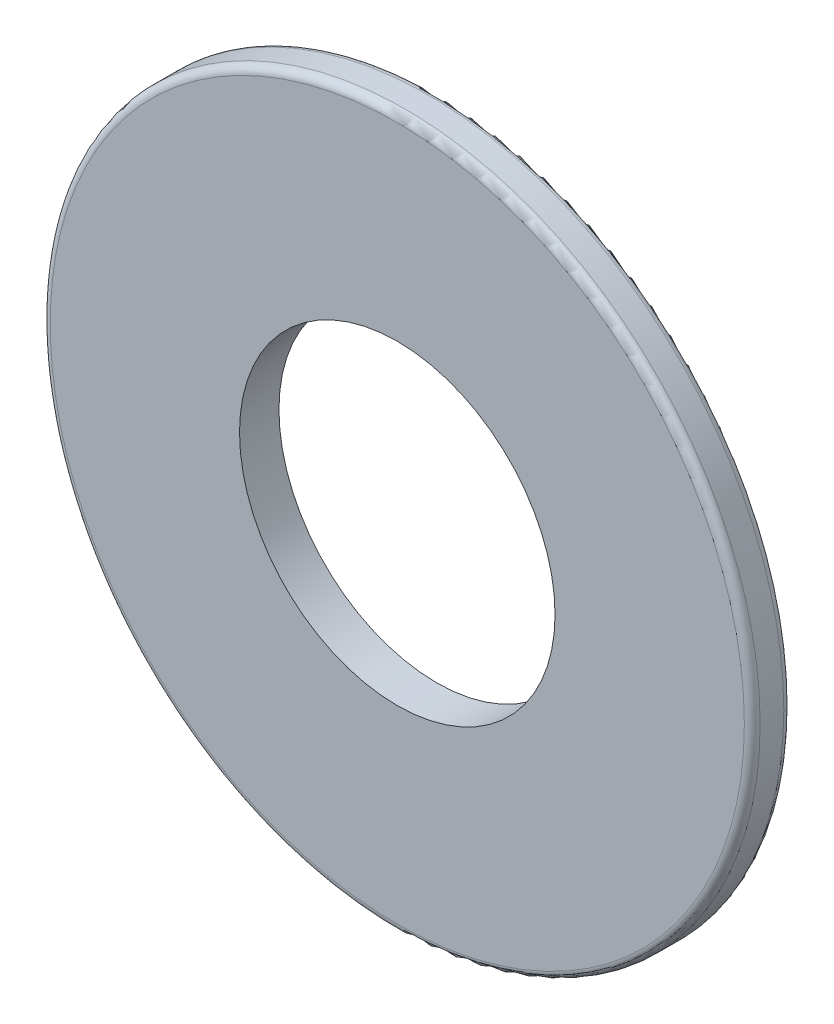
ISO-10303-21;
HEADER;
FILE_DESCRIPTION(('STEP AP214'),'2;1');
FILE_NAME('part.step','',(''),(''),'','','');
FILE_SCHEMA(('AUTOMOTIVE_DESIGN { 1 0 10303 214 1 1 1 1 }'));
ENDSEC;
DATA;
#1=APPLICATION_CONTEXT('core data for automotive mechanical design processes');
#2=APPLICATION_PROTOCOL_DEFINITION('international standard','automotive_design',2000,#1);
#3=PRODUCT_CONTEXT('',#1,'mechanical');
#4=PRODUCT('Part','Part','',(#3));
#5=PRODUCT_RELATED_PRODUCT_CATEGORY('part','',(#4));
#6=PRODUCT_DEFINITION_FORMATION('','',#4);
#7=PRODUCT_DEFINITION_CONTEXT('part definition',#1,'design');
#8=PRODUCT_DEFINITION('design','',#6,#7);
#9=PRODUCT_DEFINITION_SHAPE('','',#8);
#10=(LENGTH_UNIT() NAMED_UNIT(*) SI_UNIT(.MILLI.,.METRE.));
#11=(NAMED_UNIT(*) PLANE_ANGLE_UNIT() SI_UNIT($,.RADIAN.));
#12=(NAMED_UNIT(*) SI_UNIT($,.STERADIAN.) SOLID_ANGLE_UNIT());
#13=UNCERTAINTY_MEASURE_WITH_UNIT(LENGTH_MEASURE(1.E-05),#10,'distance_accuracy_value','');
#14=(GEOMETRIC_REPRESENTATION_CONTEXT(3) GLOBAL_UNCERTAINTY_ASSIGNED_CONTEXT((#13)) GLOBAL_UNIT_ASSIGNED_CONTEXT((#10,
#11,#12)) REPRESENTATION_CONTEXT('',''));
#15=CARTESIAN_POINT('',(0.,0.,0.));
#16=DIRECTION('',(0.,0.,1.));
#17=DIRECTION('',(1.,0.,0.));
#18=AXIS2_PLACEMENT_3D('',#15,#16,#17);
#19=CARTESIAN_POINT('',(0.,0.,0.5));
#20=DIRECTION('',(0.,0.,1.));
#21=DIRECTION('',(1.,0.,0.));
#22=AXIS2_PLACEMENT_3D('',#19,#20,#21);
#23=PLANE('',#22);
#24=CARTESIAN_POINT('',(0.,0.,0.5));
#25=DIRECTION('',(0.,0.,1.));
#26=DIRECTION('',(1.,0.,0.));
#27=AXIS2_PLACEMENT_3D('',#24,#25,#26);
#28=CIRCLE('',#27,4.4);
#29=CARTESIAN_POINT('',(4.4,0.,0.5));
#30=VERTEX_POINT('',#29);
#31=EDGE_CURVE('E10',#30,#30,#28,.T.);
#32=ORIENTED_EDGE('',*,*,#31,.T.);
#33=EDGE_LOOP('',(#32));
#34=FACE_BOUND('',#33,.T.);
#35=CARTESIAN_POINT('',(0.,0.,0.5));
#36=DIRECTION('',(0.,0.,1.));
#37=DIRECTION('',(1.,0.,0.));
#38=AXIS2_PLACEMENT_3D('',#35,#36,#37);
#39=CIRCLE('',#38,2.);
#40=CARTESIAN_POINT('',(2.,0.,0.5));
#41=VERTEX_POINT('',#40);
#42=EDGE_CURVE('E51',#41,#41,#39,.T.);
#43=ORIENTED_EDGE('',*,*,#42,.F.);
#44=EDGE_LOOP('',(#43));
#45=FACE_BOUND('',#44,.T.);
#46=ADVANCED_FACE('F31',(#34,#45),#23,.T.);
#47=CARTESIAN_POINT('',(0.,0.,0.));
#48=DIRECTION('',(0.,0.,1.));
#49=DIRECTION('',(1.,0.,0.));
#50=AXIS2_PLACEMENT_3D('',#47,#48,#49);
#51=PLANE('',#50);
#52=CARTESIAN_POINT('',(0.,0.,0.));
#53=DIRECTION('',(0.,0.,1.));
#54=DIRECTION('',(1.,0.,0.));
#55=AXIS2_PLACEMENT_3D('',#52,#53,#54);
#56=CIRCLE('',#55,4.4);
#57=CARTESIAN_POINT('',(4.4,0.,0.));
#58=VERTEX_POINT('',#57);
#59=EDGE_CURVE('E38',#58,#58,#56,.F.);
#60=ORIENTED_EDGE('',*,*,#59,.T.);
#61=EDGE_LOOP('',(#60));
#62=FACE_BOUND('',#61,.T.);
#63=CARTESIAN_POINT('',(0.,0.,0.));
#64=DIRECTION('',(0.,0.,1.));
#65=DIRECTION('',(1.,0.,0.));
#66=AXIS2_PLACEMENT_3D('',#63,#64,#65);
#67=CIRCLE('',#66,2.);
#68=CARTESIAN_POINT('',(2.,0.,0.));
#69=VERTEX_POINT('',#68);
#70=EDGE_CURVE('E52',#69,#69,#67,.T.);
#71=ORIENTED_EDGE('',*,*,#70,.T.);
#72=EDGE_LOOP('',(#71));
#73=FACE_BOUND('',#72,.T.);
#74=ADVANCED_FACE('F62',(#62,#73),#51,.F.);
#75=CARTESIAN_POINT('',(0.,0.,0.5));
#76=DIRECTION('',(0.,0.,-1.));
#77=DIRECTION('',(-1.,0.,0.));
#78=AXIS2_PLACEMENT_3D('',#75,#76,#77);
#79=CYLINDRICAL_SURFACE('',#78,4.5);
#80=CARTESIAN_POINT('',(0.,0.,0.1));
#81=DIRECTION('',(0.,0.,1.));
#82=DIRECTION('',(1.,0.,0.));
#83=AXIS2_PLACEMENT_3D('',#80,#81,#82);
#84=CIRCLE('',#83,4.5);
#85=CARTESIAN_POINT('',(4.5,0.,0.1));
#86=VERTEX_POINT('',#85);
#87=EDGE_CURVE('E42',#86,#86,#84,.T.);
#88=ORIENTED_EDGE('',*,*,#87,.T.);
#89=EDGE_LOOP('',(#88));
#90=FACE_BOUND('',#89,.T.);
#91=CARTESIAN_POINT('',(0.,0.,0.4));
#92=DIRECTION('',(0.,0.,1.));
#93=DIRECTION('',(1.,0.,0.));
#94=AXIS2_PLACEMENT_3D('',#91,#92,#93);
#95=CIRCLE('',#94,4.5);
#96=CARTESIAN_POINT('',(4.5,0.,0.4));
#97=VERTEX_POINT('',#96);
#98=EDGE_CURVE('E46',#97,#97,#95,.F.);
#99=ORIENTED_EDGE('',*,*,#98,.T.);
#100=EDGE_LOOP('',(#99));
#101=FACE_BOUND('',#100,.T.);
#102=ADVANCED_FACE('F67',(#90,#101),#79,.T.);
#103=CARTESIAN_POINT('',(0.,0.,0.5));
#104=DIRECTION('',(0.,0.,-1.));
#105=DIRECTION('',(-1.,0.,0.));
#106=AXIS2_PLACEMENT_3D('',#103,#104,#105);
#107=CYLINDRICAL_SURFACE('',#106,2.);
#108=ORIENTED_EDGE('',*,*,#42,.T.);
#109=EDGE_LOOP('',(#108));
#110=FACE_BOUND('',#109,.T.);
#111=ORIENTED_EDGE('',*,*,#70,.F.);
#112=EDGE_LOOP('',(#111));
#113=FACE_BOUND('',#112,.T.);
#114=ADVANCED_FACE('F58',(#110,#113),#107,.F.);
#115=CARTESIAN_POINT('',(0.,0.,0.1));
#116=DIRECTION('',(0.,0.,1.));
#117=DIRECTION('',(1.,0.,0.));
#118=AXIS2_PLACEMENT_3D('',#115,#116,#117);
#119=TOROIDAL_SURFACE('',#118,4.4,0.1);
#120=ORIENTED_EDGE('',*,*,#59,.F.);
#121=EDGE_LOOP('',(#120));
#122=FACE_BOUND('',#121,.T.);
#123=ORIENTED_EDGE('',*,*,#87,.F.);
#124=EDGE_LOOP('',(#123));
#125=FACE_BOUND('',#124,.T.);
#126=ADVANCED_FACE('F73',(#122,#125),#119,.T.);
#127=CARTESIAN_POINT('',(0.,0.,0.4));
#128=DIRECTION('',(0.,0.,1.));
#129=DIRECTION('',(1.,0.,0.));
#130=AXIS2_PLACEMENT_3D('',#127,#128,#129);
#131=TOROIDAL_SURFACE('',#130,4.4,0.1);
#132=ORIENTED_EDGE('',*,*,#98,.F.);
#133=EDGE_LOOP('',(#132));
#134=FACE_BOUND('',#133,.T.);
#135=ORIENTED_EDGE('',*,*,#31,.F.);
#136=EDGE_LOOP('',(#135));
#137=FACE_BOUND('',#136,.T.);
#138=ADVANCED_FACE('F33',(#134,#137),#131,.T.);
#139=CLOSED_SHELL('',(#46,#74,#102,#114,#126,#138));
#140=MANIFOLD_SOLID_BREP('B2',#139);
#141=ADVANCED_BREP_SHAPE_REPRESENTATION('',(#18,#140),#14);
#142=SHAPE_DEFINITION_REPRESENTATION(#9,#141);
ENDSEC;
END-ISO-10303-21;
